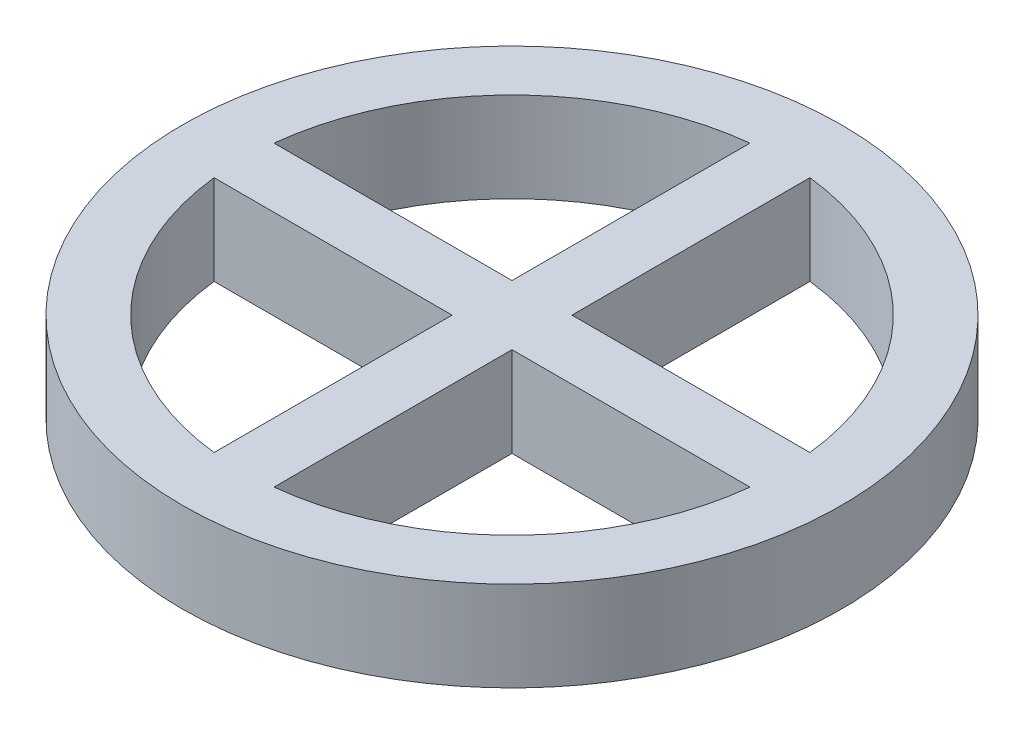
ISO-10303-21;
HEADER;
FILE_DESCRIPTION(('STEP AP214'),'2;1');
FILE_NAME('part.step','',(''),(''),'','','');
FILE_SCHEMA(('AUTOMOTIVE_DESIGN { 1 0 10303 214 1 1 1 1 }'));
ENDSEC;
DATA;
#1=APPLICATION_CONTEXT('core data for automotive mechanical design processes');
#2=APPLICATION_PROTOCOL_DEFINITION('international standard','automotive_design',2000,#1);
#3=PRODUCT_CONTEXT('',#1,'mechanical');
#4=PRODUCT('Part','Part','',(#3));
#5=PRODUCT_RELATED_PRODUCT_CATEGORY('part','',(#4));
#6=PRODUCT_DEFINITION_FORMATION('','',#4);
#7=PRODUCT_DEFINITION_CONTEXT('part definition',#1,'design');
#8=PRODUCT_DEFINITION('design','',#6,#7);
#9=PRODUCT_DEFINITION_SHAPE('','',#8);
#10=(LENGTH_UNIT() NAMED_UNIT(*) SI_UNIT(.MILLI.,.METRE.));
#11=(NAMED_UNIT(*) PLANE_ANGLE_UNIT() SI_UNIT($,.RADIAN.));
#12=(NAMED_UNIT(*) SI_UNIT($,.STERADIAN.) SOLID_ANGLE_UNIT());
#13=UNCERTAINTY_MEASURE_WITH_UNIT(LENGTH_MEASURE(1.E-05),#10,'distance_accuracy_value','');
#14=(GEOMETRIC_REPRESENTATION_CONTEXT(3) GLOBAL_UNCERTAINTY_ASSIGNED_CONTEXT((#13)) GLOBAL_UNIT_ASSIGNED_CONTEXT((#10,
#11,#12)) REPRESENTATION_CONTEXT('',''));
#15=CARTESIAN_POINT('',(0.,0.,0.));
#16=DIRECTION('',(0.,0.,1.));
#17=DIRECTION('',(1.,0.,0.));
#18=AXIS2_PLACEMENT_3D('',#15,#16,#17);
#19=CARTESIAN_POINT('',(51.1,0.,-86.5));
#20=DIRECTION('',(0.,-1.,0.));
#21=DIRECTION('',(0.,0.,-1.));
#22=AXIS2_PLACEMENT_3D('',#19,#20,#21);
#23=PLANE('',#22);
#24=DIRECTION('',(1.,0.,0.));
#25=VECTOR('',#24,1.);
#26=CARTESIAN_POINT('',(0.,0.,-5.54999999999996));
#27=LINE('',#26,#25);
#28=CARTESIAN_POINT('',(45.55,0.,-5.54999999999996));
#29=VERTEX_POINT('',#28);
#30=CARTESIAN_POINT('',(53.4942719099992,0.,-5.54999999999996));
#31=VERTEX_POINT('',#30);
#32=EDGE_CURVE('E150',#29,#31,#27,.T.);
#33=ORIENTED_EDGE('',*,*,#32,.T.);
#34=CARTESIAN_POINT('',(44.55,0.,-6.54999999999994));
#35=DIRECTION('',(0.,-1.,0.));
#36=DIRECTION('',(0.,0.,-1.));
#37=AXIS2_PLACEMENT_3D('',#34,#35,#36);
#38=CIRCLE('',#37,8.99999999999999);
#39=CARTESIAN_POINT('',(45.55,0.,2.39427190999921));
#40=VERTEX_POINT('',#39);
#41=EDGE_CURVE('E218',#31,#40,#38,.T.);
#42=ORIENTED_EDGE('',*,*,#41,.T.);
#43=DIRECTION('',(0.,0.,1.));
#44=VECTOR('',#43,1.);
#45=CARTESIAN_POINT('',(45.55,0.,0.));
#46=LINE('',#45,#44);
#47=EDGE_CURVE('E11',#29,#40,#46,.T.);
#48=ORIENTED_EDGE('',*,*,#47,.F.);
#49=EDGE_LOOP('',(#33,#42,#48));
#50=FACE_BOUND('',#49,.T.);
#51=CARTESIAN_POINT('',(44.55,0.,-6.54999999999994));
#52=DIRECTION('',(0.,-1.,0.));
#53=DIRECTION('',(0.,0.,-1.));
#54=AXIS2_PLACEMENT_3D('',#51,#52,#53);
#55=CIRCLE('',#54,9.00000000000001);
#56=CARTESIAN_POINT('',(35.6057280900009,0.,-7.54999999999996));
#57=VERTEX_POINT('',#56);
#58=CARTESIAN_POINT('',(43.55,0.,-15.4942719099991));
#59=VERTEX_POINT('',#58);
#60=EDGE_CURVE('E215',#57,#59,#55,.T.);
#61=ORIENTED_EDGE('',*,*,#60,.T.);
#62=DIRECTION('',(0.,0.,1.));
#63=VECTOR('',#62,1.);
#64=CARTESIAN_POINT('',(43.55,0.,0.));
#65=LINE('',#64,#63);
#66=CARTESIAN_POINT('',(43.55,0.,-7.54999999999996));
#67=VERTEX_POINT('',#66);
#68=EDGE_CURVE('E148',#59,#67,#65,.T.);
#69=ORIENTED_EDGE('',*,*,#68,.T.);
#70=DIRECTION('',(1.,0.,0.));
#71=VECTOR('',#70,1.);
#72=CARTESIAN_POINT('',(0.,0.,-7.54999999999996));
#73=LINE('',#72,#71);
#74=EDGE_CURVE('E50',#57,#67,#73,.T.);
#75=ORIENTED_EDGE('',*,*,#74,.F.);
#76=EDGE_LOOP('',(#61,#69,#75));
#77=FACE_BOUND('',#76,.T.);
#78=CARTESIAN_POINT('',(44.55,0.,-6.54999999999994));
#79=DIRECTION('',(0.,-1.,0.));
#80=DIRECTION('',(0.,0.,-1.));
#81=AXIS2_PLACEMENT_3D('',#78,#79,#80);
#82=CIRCLE('',#81,9.00000000000001);
#83=CARTESIAN_POINT('',(45.55,0.,-15.4942719099991));
#84=VERTEX_POINT('',#83);
#85=CARTESIAN_POINT('',(53.4942719099992,0.,-7.54999999999996));
#86=VERTEX_POINT('',#85);
#87=EDGE_CURVE('E213',#84,#86,#82,.T.);
#88=ORIENTED_EDGE('',*,*,#87,.T.);
#89=CARTESIAN_POINT('',(45.55,0.,-7.54999999999996));
#90=VERTEX_POINT('',#89);
#91=EDGE_CURVE('E186',#90,#86,#73,.T.);
#92=ORIENTED_EDGE('',*,*,#91,.F.);
#93=EDGE_CURVE('E52',#84,#90,#46,.T.);
#94=ORIENTED_EDGE('',*,*,#93,.F.);
#95=EDGE_LOOP('',(#88,#92,#94));
#96=FACE_BOUND('',#95,.T.);
#97=CARTESIAN_POINT('',(35.6057280900009,0.,-5.54999999999996));
#98=VERTEX_POINT('',#97);
#99=CARTESIAN_POINT('',(43.55,0.,-5.54999999999996));
#100=VERTEX_POINT('',#99);
#101=EDGE_CURVE('E146',#98,#100,#27,.T.);
#102=ORIENTED_EDGE('',*,*,#101,.T.);
#103=CARTESIAN_POINT('',(43.55,0.,2.3942719099992));
#104=VERTEX_POINT('',#103);
#105=EDGE_CURVE('E141',#100,#104,#65,.T.);
#106=ORIENTED_EDGE('',*,*,#105,.T.);
#107=CARTESIAN_POINT('',(44.55,0.,-6.54999999999994));
#108=DIRECTION('',(0.,-1.,0.));
#109=DIRECTION('',(0.,0.,-1.));
#110=AXIS2_PLACEMENT_3D('',#107,#108,#109);
#111=CIRCLE('',#110,8.99999999999999);
#112=EDGE_CURVE('E44',#104,#98,#111,.T.);
#113=ORIENTED_EDGE('',*,*,#112,.T.);
#114=EDGE_LOOP('',(#102,#106,#113));
#115=FACE_BOUND('',#114,.T.);
#116=CARTESIAN_POINT('',(44.55,0.,-6.54999999999994));
#117=DIRECTION('',(0.,1.,0.));
#118=DIRECTION('',(0.,0.,1.));
#119=AXIS2_PLACEMENT_3D('',#116,#117,#118);
#120=CIRCLE('',#119,11.);
#121=CARTESIAN_POINT('',(44.55,0.,4.45000000000005));
#122=VERTEX_POINT('',#121);
#123=EDGE_CURVE('E160',#122,#122,#120,.F.);
#124=ORIENTED_EDGE('',*,*,#123,.F.);
#125=EDGE_LOOP('',(#124));
#126=FACE_BOUND('',#125,.T.);
#127=ADVANCED_FACE('F41',(#50,#77,#96,#115,#126),#23,.F.);
#128=CARTESIAN_POINT('',(0.,-3.,-5.54999999999996));
#129=DIRECTION('',(0.,0.,1.));
#130=DIRECTION('',(1.,0.,0.));
#131=AXIS2_PLACEMENT_3D('',#128,#129,#130);
#132=PLANE('',#131);
#133=ORIENTED_EDGE('',*,*,#101,.F.);
#134=DIRECTION('',(0.,1.,0.));
#135=VECTOR('',#134,1.);
#136=CARTESIAN_POINT('',(35.6057280900009,-3.,-5.54999999999996));
#137=LINE('',#136,#135);
#138=CARTESIAN_POINT('',(35.6057280900009,-3.,-5.54999999999996));
#139=VERTEX_POINT('',#138);
#140=EDGE_CURVE('E101',#139,#98,#137,.T.);
#141=ORIENTED_EDGE('',*,*,#140,.F.);
#142=DIRECTION('',(1.,0.,0.));
#143=VECTOR('',#142,1.);
#144=CARTESIAN_POINT('',(0.,-3.,-5.54999999999996));
#145=LINE('',#144,#143);
#146=CARTESIAN_POINT('',(43.55,-3.,-5.54999999999996));
#147=VERTEX_POINT('',#146);
#148=EDGE_CURVE('E152',#139,#147,#145,.T.);
#149=ORIENTED_EDGE('',*,*,#148,.T.);
#150=DIRECTION('',(0.,1.,0.));
#151=VECTOR('',#150,1.);
#152=CARTESIAN_POINT('',(43.55,-3.,-5.54999999999996));
#153=LINE('',#152,#151);
#154=EDGE_CURVE('E109',#147,#100,#153,.T.);
#155=ORIENTED_EDGE('',*,*,#154,.T.);
#156=EDGE_LOOP('',(#133,#141,#149,#155));
#157=FACE_BOUND('',#156,.T.);
#158=ADVANCED_FACE('F151',(#157),#132,.T.);
#159=CARTESIAN_POINT('',(45.55,-3.,0.));
#160=DIRECTION('',(-1.,0.,0.));
#161=DIRECTION('',(0.,0.,1.));
#162=AXIS2_PLACEMENT_3D('',#159,#160,#161);
#163=PLANE('',#162);
#164=ORIENTED_EDGE('',*,*,#47,.T.);
#165=DIRECTION('',(0.,1.,0.));
#166=VECTOR('',#165,1.);
#167=CARTESIAN_POINT('',(45.55,-3.,2.3942719099992));
#168=LINE('',#167,#166);
#169=CARTESIAN_POINT('',(45.55,-3.,2.3942719099992));
#170=VERTEX_POINT('',#169);
#171=EDGE_CURVE('E157',#170,#40,#168,.T.);
#172=ORIENTED_EDGE('',*,*,#171,.F.);
#173=DIRECTION('',(0.,0.,1.));
#174=VECTOR('',#173,1.);
#175=CARTESIAN_POINT('',(45.55,-3.,0.));
#176=LINE('',#175,#174);
#177=CARTESIAN_POINT('',(45.55,-3.,-5.54999999999996));
#178=VERTEX_POINT('',#177);
#179=EDGE_CURVE('E204',#178,#170,#176,.T.);
#180=ORIENTED_EDGE('',*,*,#179,.F.);
#181=DIRECTION('',(0.,1.,0.));
#182=VECTOR('',#181,1.);
#183=CARTESIAN_POINT('',(45.55,-3.,-5.54999999999996));
#184=LINE('',#183,#182);
#185=EDGE_CURVE('E164',#178,#29,#184,.T.);
#186=ORIENTED_EDGE('',*,*,#185,.T.);
#187=EDGE_LOOP('',(#164,#172,#180,#186));
#188=FACE_BOUND('',#187,.T.);
#189=ADVANCED_FACE('F234',(#188),#163,.F.);
#190=CARTESIAN_POINT('',(0.,-3.,-7.54999999999996));
#191=DIRECTION('',(0.,0.,1.));
#192=DIRECTION('',(1.,0.,0.));
#193=AXIS2_PLACEMENT_3D('',#190,#191,#192);
#194=PLANE('',#193);
#195=ORIENTED_EDGE('',*,*,#74,.T.);
#196=DIRECTION('',(0.,1.,0.));
#197=VECTOR('',#196,1.);
#198=CARTESIAN_POINT('',(43.55,-3.,-7.54999999999996));
#199=LINE('',#198,#197);
#200=CARTESIAN_POINT('',(43.55,-3.,-7.54999999999996));
#201=VERTEX_POINT('',#200);
#202=EDGE_CURVE('E170',#201,#67,#199,.T.);
#203=ORIENTED_EDGE('',*,*,#202,.F.);
#204=DIRECTION('',(1.,0.,0.));
#205=VECTOR('',#204,1.);
#206=CARTESIAN_POINT('',(0.,-3.,-7.54999999999996));
#207=LINE('',#206,#205);
#208=CARTESIAN_POINT('',(35.6057280900009,-3.,-7.54999999999996));
#209=VERTEX_POINT('',#208);
#210=EDGE_CURVE('E199',#209,#201,#207,.T.);
#211=ORIENTED_EDGE('',*,*,#210,.F.);
#212=DIRECTION('',(0.,1.,0.));
#213=VECTOR('',#212,1.);
#214=CARTESIAN_POINT('',(35.6057280900009,-3.,-7.54999999999996));
#215=LINE('',#214,#213);
#216=EDGE_CURVE('E167',#209,#57,#215,.T.);
#217=ORIENTED_EDGE('',*,*,#216,.T.);
#218=EDGE_LOOP('',(#195,#203,#211,#217));
#219=FACE_BOUND('',#218,.T.);
#220=ADVANCED_FACE('F268',(#219),#194,.F.);
#221=ORIENTED_EDGE('',*,*,#93,.T.);
#222=DIRECTION('',(0.,1.,0.));
#223=VECTOR('',#222,1.);
#224=CARTESIAN_POINT('',(45.55,-3.,-7.54999999999996));
#225=LINE('',#224,#223);
#226=CARTESIAN_POINT('',(45.55,-3.,-7.54999999999996));
#227=VERTEX_POINT('',#226);
#228=EDGE_CURVE('E178',#227,#90,#225,.T.);
#229=ORIENTED_EDGE('',*,*,#228,.F.);
#230=CARTESIAN_POINT('',(45.55,-3.,-15.4942719099991));
#231=VERTEX_POINT('',#230);
#232=EDGE_CURVE('E198',#231,#227,#176,.T.);
#233=ORIENTED_EDGE('',*,*,#232,.F.);
#234=DIRECTION('',(0.,1.,0.));
#235=VECTOR('',#234,1.);
#236=CARTESIAN_POINT('',(45.55,-3.,-15.4942719099991));
#237=LINE('',#236,#235);
#238=EDGE_CURVE('E174',#231,#84,#237,.T.);
#239=ORIENTED_EDGE('',*,*,#238,.T.);
#240=EDGE_LOOP('',(#221,#229,#233,#239));
#241=FACE_BOUND('',#240,.T.);
#242=ADVANCED_FACE('F240',(#241),#163,.F.);
#243=CARTESIAN_POINT('',(0.,-3.,0.));
#244=DIRECTION('',(0.,-1.,0.));
#245=DIRECTION('',(0.,0.,-1.));
#246=AXIS2_PLACEMENT_3D('',#243,#244,#245);
#247=PLANE('',#246);
#248=DIRECTION('',(0.,0.,1.));
#249=VECTOR('',#248,1.);
#250=CARTESIAN_POINT('',(43.55,-3.,0.));
#251=LINE('',#250,#249);
#252=CARTESIAN_POINT('',(43.55,-3.,2.3942719099992));
#253=VERTEX_POINT('',#252);
#254=EDGE_CURVE('E211',#147,#253,#251,.T.);
#255=ORIENTED_EDGE('',*,*,#254,.F.);
#256=ORIENTED_EDGE('',*,*,#148,.F.);
#257=CARTESIAN_POINT('',(44.55,-3.,-6.54999999999994));
#258=DIRECTION('',(0.,-1.,0.));
#259=DIRECTION('',(0.,0.,-1.));
#260=AXIS2_PLACEMENT_3D('',#257,#258,#259);
#261=CIRCLE('',#260,8.99999999999999);
#262=EDGE_CURVE('E207',#253,#139,#261,.T.);
#263=ORIENTED_EDGE('',*,*,#262,.F.);
#264=EDGE_LOOP('',(#255,#256,#263));
#265=FACE_BOUND('',#264,.T.);
#266=CARTESIAN_POINT('',(53.4942719099992,-3.,-5.54999999999996));
#267=VERTEX_POINT('',#266);
#268=EDGE_CURVE('E206',#178,#267,#145,.T.);
#269=ORIENTED_EDGE('',*,*,#268,.F.);
#270=ORIENTED_EDGE('',*,*,#179,.T.);
#271=CARTESIAN_POINT('',(44.55,-3.,-6.54999999999994));
#272=DIRECTION('',(0.,-1.,0.));
#273=DIRECTION('',(0.,0.,-1.));
#274=AXIS2_PLACEMENT_3D('',#271,#272,#273);
#275=CIRCLE('',#274,8.99999999999999);
#276=EDGE_CURVE('E201',#267,#170,#275,.T.);
#277=ORIENTED_EDGE('',*,*,#276,.F.);
#278=EDGE_LOOP('',(#269,#270,#277));
#279=FACE_BOUND('',#278,.T.);
#280=ORIENTED_EDGE('',*,*,#210,.T.);
#281=CARTESIAN_POINT('',(43.55,-3.,-15.4942719099991));
#282=VERTEX_POINT('',#281);
#283=EDGE_CURVE('E197',#282,#201,#251,.T.);
#284=ORIENTED_EDGE('',*,*,#283,.F.);
#285=CARTESIAN_POINT('',(44.55,-3.,-6.54999999999994));
#286=DIRECTION('',(0.,-1.,0.));
#287=DIRECTION('',(0.,0.,-1.));
#288=AXIS2_PLACEMENT_3D('',#285,#286,#287);
#289=CIRCLE('',#288,9.00000000000001);
#290=EDGE_CURVE('E194',#209,#282,#289,.T.);
#291=ORIENTED_EDGE('',*,*,#290,.F.);
#292=EDGE_LOOP('',(#280,#284,#291));
#293=FACE_BOUND('',#292,.T.);
#294=ORIENTED_EDGE('',*,*,#232,.T.);
#295=CARTESIAN_POINT('',(53.4942719099992,-3.,-7.54999999999996));
#296=VERTEX_POINT('',#295);
#297=EDGE_CURVE('E193',#227,#296,#207,.T.);
#298=ORIENTED_EDGE('',*,*,#297,.T.);
#299=CARTESIAN_POINT('',(44.55,-3.,-6.54999999999994));
#300=DIRECTION('',(0.,-1.,0.));
#301=DIRECTION('',(0.,0.,-1.));
#302=AXIS2_PLACEMENT_3D('',#299,#300,#301);
#303=CIRCLE('',#302,9.00000000000001);
#304=EDGE_CURVE('E190',#231,#296,#303,.T.);
#305=ORIENTED_EDGE('',*,*,#304,.F.);
#306=EDGE_LOOP('',(#294,#298,#305));
#307=FACE_BOUND('',#306,.T.);
#308=CARTESIAN_POINT('',(44.55,-3.,-6.54999999999994));
#309=DIRECTION('',(0.,-1.,0.));
#310=DIRECTION('',(0.,0.,-1.));
#311=AXIS2_PLACEMENT_3D('',#308,#309,#310);
#312=CIRCLE('',#311,11.);
#313=CARTESIAN_POINT('',(44.55,-3.,-17.5499999999999));
#314=VERTEX_POINT('',#313);
#315=EDGE_CURVE('E163',#314,#314,#312,.T.);
#316=ORIENTED_EDGE('',*,*,#315,.T.);
#317=EDGE_LOOP('',(#316));
#318=FACE_BOUND('',#317,.T.);
#319=ADVANCED_FACE('F236',(#265,#279,#293,#307,#318),#247,.T.);
#320=CARTESIAN_POINT('',(44.55,-3.,-6.54999999999994));
#321=DIRECTION('',(0.,1.,0.));
#322=DIRECTION('',(0.,0.,1.));
#323=AXIS2_PLACEMENT_3D('',#320,#321,#322);
#324=CYLINDRICAL_SURFACE('',#323,9.00000000000001);
#325=ORIENTED_EDGE('',*,*,#87,.F.);
#326=ORIENTED_EDGE('',*,*,#238,.F.);
#327=ORIENTED_EDGE('',*,*,#304,.T.);
#328=DIRECTION('',(0.,1.,0.));
#329=VECTOR('',#328,1.);
#330=CARTESIAN_POINT('',(53.4942719099992,-3.,-7.54999999999996));
#331=LINE('',#330,#329);
#332=EDGE_CURVE('E181',#296,#86,#331,.T.);
#333=ORIENTED_EDGE('',*,*,#332,.T.);
#334=EDGE_LOOP('',(#325,#326,#327,#333));
#335=FACE_BOUND('',#334,.T.);
#336=ADVANCED_FACE('F239',(#335),#324,.F.);
#337=ORIENTED_EDGE('',*,*,#91,.T.);
#338=ORIENTED_EDGE('',*,*,#332,.F.);
#339=ORIENTED_EDGE('',*,*,#297,.F.);
#340=ORIENTED_EDGE('',*,*,#228,.T.);
#341=EDGE_LOOP('',(#337,#338,#339,#340));
#342=FACE_BOUND('',#341,.T.);
#343=ADVANCED_FACE('F284',(#342),#194,.F.);
#344=CARTESIAN_POINT('',(44.55,-3.,-6.54999999999994));
#345=DIRECTION('',(0.,1.,0.));
#346=DIRECTION('',(0.,0.,1.));
#347=AXIS2_PLACEMENT_3D('',#344,#345,#346);
#348=CYLINDRICAL_SURFACE('',#347,9.00000000000001);
#349=ORIENTED_EDGE('',*,*,#60,.F.);
#350=ORIENTED_EDGE('',*,*,#216,.F.);
#351=ORIENTED_EDGE('',*,*,#290,.T.);
#352=DIRECTION('',(0.,1.,0.));
#353=VECTOR('',#352,1.);
#354=CARTESIAN_POINT('',(43.55,-3.,-15.4942719099991));
#355=LINE('',#354,#353);
#356=EDGE_CURVE('E173',#282,#59,#355,.T.);
#357=ORIENTED_EDGE('',*,*,#356,.T.);
#358=EDGE_LOOP('',(#349,#350,#351,#357));
#359=FACE_BOUND('',#358,.T.);
#360=ADVANCED_FACE('F278',(#359),#348,.F.);
#361=CARTESIAN_POINT('',(43.55,-3.,0.));
#362=DIRECTION('',(-1.,0.,0.));
#363=DIRECTION('',(0.,0.,1.));
#364=AXIS2_PLACEMENT_3D('',#361,#362,#363);
#365=PLANE('',#364);
#366=ORIENTED_EDGE('',*,*,#68,.F.);
#367=ORIENTED_EDGE('',*,*,#356,.F.);
#368=ORIENTED_EDGE('',*,*,#283,.T.);
#369=ORIENTED_EDGE('',*,*,#202,.T.);
#370=EDGE_LOOP('',(#366,#367,#368,#369));
#371=FACE_BOUND('',#370,.T.);
#372=ADVANCED_FACE('F273',(#371),#365,.T.);
#373=ORIENTED_EDGE('',*,*,#32,.F.);
#374=ORIENTED_EDGE('',*,*,#185,.F.);
#375=ORIENTED_EDGE('',*,*,#268,.T.);
#376=DIRECTION('',(0.,1.,0.));
#377=VECTOR('',#376,1.);
#378=CARTESIAN_POINT('',(53.4942719099992,-3.,-5.54999999999996));
#379=LINE('',#378,#377);
#380=EDGE_CURVE('E153',#267,#31,#379,.T.);
#381=ORIENTED_EDGE('',*,*,#380,.T.);
#382=EDGE_LOOP('',(#373,#374,#375,#381));
#383=FACE_BOUND('',#382,.T.);
#384=ADVANCED_FACE('F226',(#383),#132,.T.);
#385=CARTESIAN_POINT('',(44.55,-3.,-6.54999999999994));
#386=DIRECTION('',(0.,1.,0.));
#387=DIRECTION('',(0.,0.,1.));
#388=AXIS2_PLACEMENT_3D('',#385,#386,#387);
#389=CYLINDRICAL_SURFACE('',#388,8.99999999999999);
#390=ORIENTED_EDGE('',*,*,#41,.F.);
#391=ORIENTED_EDGE('',*,*,#380,.F.);
#392=ORIENTED_EDGE('',*,*,#276,.T.);
#393=ORIENTED_EDGE('',*,*,#171,.T.);
#394=EDGE_LOOP('',(#390,#391,#392,#393));
#395=FACE_BOUND('',#394,.T.);
#396=ADVANCED_FACE('F230',(#395),#389,.F.);
#397=ORIENTED_EDGE('',*,*,#105,.F.);
#398=ORIENTED_EDGE('',*,*,#154,.F.);
#399=ORIENTED_EDGE('',*,*,#254,.T.);
#400=DIRECTION('',(0.,1.,0.));
#401=VECTOR('',#400,1.);
#402=CARTESIAN_POINT('',(43.55,-3.,2.3942719099992));
#403=LINE('',#402,#401);
#404=EDGE_CURVE('E144',#253,#104,#403,.T.);
#405=ORIENTED_EDGE('',*,*,#404,.T.);
#406=EDGE_LOOP('',(#397,#398,#399,#405));
#407=FACE_BOUND('',#406,.T.);
#408=ADVANCED_FACE('F143',(#407),#365,.T.);
#409=CARTESIAN_POINT('',(44.55,-3.,-6.54999999999994));
#410=DIRECTION('',(0.,1.,0.));
#411=DIRECTION('',(0.,0.,1.));
#412=AXIS2_PLACEMENT_3D('',#409,#410,#411);
#413=CYLINDRICAL_SURFACE('',#412,8.99999999999999);
#414=ORIENTED_EDGE('',*,*,#112,.F.);
#415=ORIENTED_EDGE('',*,*,#404,.F.);
#416=ORIENTED_EDGE('',*,*,#262,.T.);
#417=ORIENTED_EDGE('',*,*,#140,.T.);
#418=EDGE_LOOP('',(#414,#415,#416,#417));
#419=FACE_BOUND('',#418,.T.);
#420=ADVANCED_FACE('F256',(#419),#413,.F.);
#421=CARTESIAN_POINT('',(44.55,-3.,-6.54999999999994));
#422=DIRECTION('',(0.,1.,0.));
#423=DIRECTION('',(0.,0.,1.));
#424=AXIS2_PLACEMENT_3D('',#421,#422,#423);
#425=CYLINDRICAL_SURFACE('',#424,11.);
#426=ORIENTED_EDGE('',*,*,#315,.F.);
#427=EDGE_LOOP('',(#426));
#428=FACE_BOUND('',#427,.T.);
#429=ORIENTED_EDGE('',*,*,#123,.T.);
#430=EDGE_LOOP('',(#429));
#431=FACE_BOUND('',#430,.T.);
#432=ADVANCED_FACE('F253',(#428,#431),#425,.T.);
#433=CLOSED_SHELL('',(#127,#158,#189,#220,#242,#319,#336,#343,#360,#372,#384,#396,#408,#420,#432));
#434=MANIFOLD_SOLID_BREP('B2',#433);
#435=ADVANCED_BREP_SHAPE_REPRESENTATION('',(#18,#434),#14);
#436=SHAPE_DEFINITION_REPRESENTATION(#9,#435);
ENDSEC;
END-ISO-10303-21;
